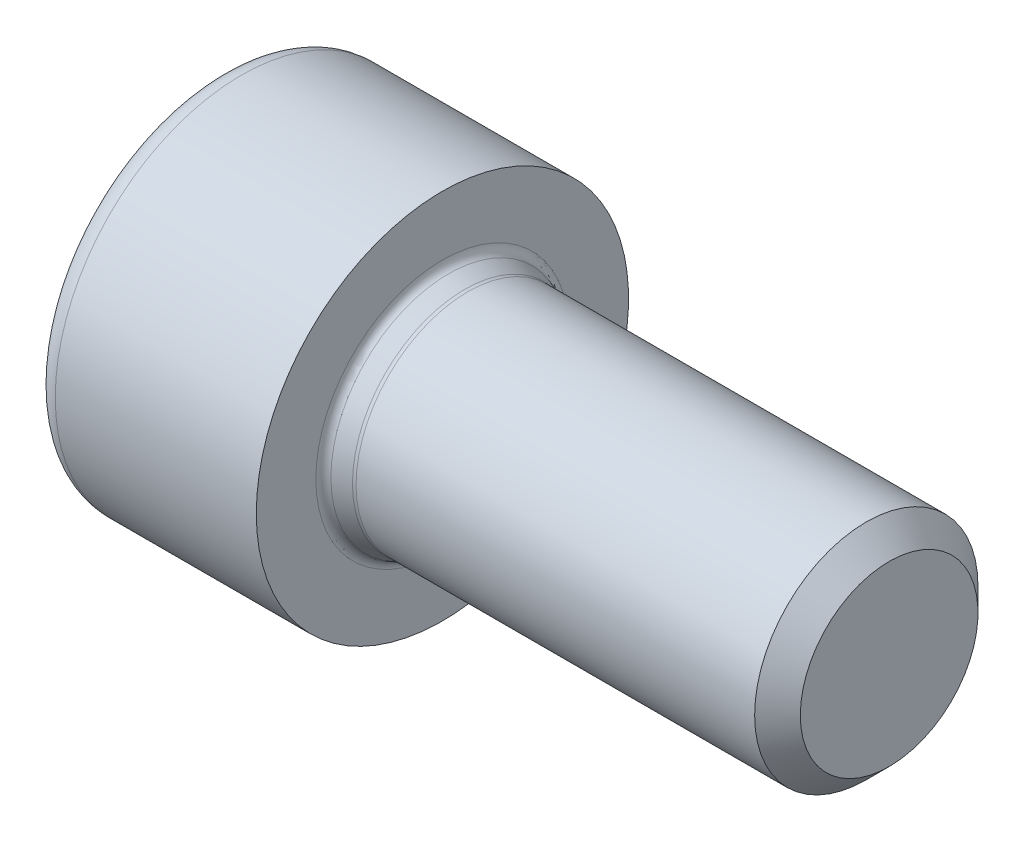
ISO-10303-21;
HEADER;
FILE_DESCRIPTION(('STEP AP214'),'2;1');
FILE_NAME('part.step','',(''),(''),'','','');
FILE_SCHEMA(('AUTOMOTIVE_DESIGN { 1 0 10303 214 1 1 1 1 }'));
ENDSEC;
DATA;
#1=APPLICATION_CONTEXT('core data for automotive mechanical design processes');
#2=APPLICATION_PROTOCOL_DEFINITION('international standard','automotive_design',2000,#1);
#3=PRODUCT_CONTEXT('',#1,'mechanical');
#4=PRODUCT('Part','Part','',(#3));
#5=PRODUCT_RELATED_PRODUCT_CATEGORY('part','',(#4));
#6=PRODUCT_DEFINITION_FORMATION('','',#4);
#7=PRODUCT_DEFINITION_CONTEXT('part definition',#1,'design');
#8=PRODUCT_DEFINITION('design','',#6,#7);
#9=PRODUCT_DEFINITION_SHAPE('','',#8);
#10=(LENGTH_UNIT() NAMED_UNIT(*) SI_UNIT(.MILLI.,.METRE.));
#11=(NAMED_UNIT(*) PLANE_ANGLE_UNIT() SI_UNIT($,.RADIAN.));
#12=(NAMED_UNIT(*) SI_UNIT($,.STERADIAN.) SOLID_ANGLE_UNIT());
#13=UNCERTAINTY_MEASURE_WITH_UNIT(LENGTH_MEASURE(1.E-05),#10,'distance_accuracy_value','');
#14=(GEOMETRIC_REPRESENTATION_CONTEXT(3) GLOBAL_UNCERTAINTY_ASSIGNED_CONTEXT((#13)) GLOBAL_UNIT_ASSIGNED_CONTEXT((#10,
#11,#12)) REPRESENTATION_CONTEXT('',''));
#15=CARTESIAN_POINT('',(0.,0.,0.));
#16=DIRECTION('',(0.,0.,1.));
#17=DIRECTION('',(1.,0.,0.));
#18=AXIS2_PLACEMENT_3D('',#15,#16,#17);
#19=CARTESIAN_POINT('',(-6.,2.5,0.));
#20=DIRECTION('',(1.,0.,0.));
#21=DIRECTION('',(0.,0.,-1.));
#22=AXIS2_PLACEMENT_3D('',#19,#20,#21);
#23=PLANE('',#22);
#24=DIRECTION('',(0.,0.5,-0.866025403784439));
#25=VECTOR('',#24,1.);
#26=CARTESIAN_POINT('',(-6.,-1.5400635094611,-2.33253175473055));
#27=LINE('',#26,#25);
#28=CARTESIAN_POINT('',(-6.,-2.88675134594813,0.));
#29=VERTEX_POINT('',#28);
#30=CARTESIAN_POINT('',(-6.,-1.44337567297406,-2.5));
#31=VERTEX_POINT('',#30);
#32=EDGE_CURVE('E250',#29,#31,#27,.T.);
#33=ORIENTED_EDGE('',*,*,#32,.T.);
#34=DIRECTION('',(0.,1.,0.));
#35=VECTOR('',#34,1.);
#36=CARTESIAN_POINT('',(-6.,2.5,-2.5));
#37=LINE('',#36,#35);
#38=CARTESIAN_POINT('',(-6.,1.44337567297406,-2.5));
#39=VERTEX_POINT('',#38);
#40=EDGE_CURVE('E52',#31,#39,#37,.T.);
#41=ORIENTED_EDGE('',*,*,#40,.T.);
#42=DIRECTION('',(0.,0.5,0.866025403784439));
#43=VECTOR('',#42,1.);
#44=CARTESIAN_POINT('',(-6.,2.7900635094611,-0.167468245269452));
#45=LINE('',#44,#43);
#46=CARTESIAN_POINT('',(-6.,2.88675134594813,0.));
#47=VERTEX_POINT('',#46);
#48=EDGE_CURVE('E100',#39,#47,#45,.T.);
#49=ORIENTED_EDGE('',*,*,#48,.T.);
#50=DIRECTION('',(0.,-0.5,0.866025403784439));
#51=VECTOR('',#50,1.);
#52=CARTESIAN_POINT('',(-6.,2.7900635094611,0.167468245269452));
#53=LINE('',#52,#51);
#54=CARTESIAN_POINT('',(-6.,1.44337567297406,2.5));
#55=VERTEX_POINT('',#54);
#56=EDGE_CURVE('E249',#47,#55,#53,.T.);
#57=ORIENTED_EDGE('',*,*,#56,.T.);
#58=DIRECTION('',(0.,-1.,0.));
#59=VECTOR('',#58,1.);
#60=CARTESIAN_POINT('',(-6.,2.5,2.5));
#61=LINE('',#60,#59);
#62=CARTESIAN_POINT('',(-6.,-1.44337567297406,2.5));
#63=VERTEX_POINT('',#62);
#64=EDGE_CURVE('E182',#55,#63,#61,.T.);
#65=ORIENTED_EDGE('',*,*,#64,.T.);
#66=DIRECTION('',(0.,-0.5,-0.866025403784439));
#67=VECTOR('',#66,1.);
#68=CARTESIAN_POINT('',(-6.,-1.5400635094611,2.33253175473055));
#69=LINE('',#68,#67);
#70=EDGE_CURVE('E241',#63,#29,#69,.T.);
#71=ORIENTED_EDGE('',*,*,#70,.T.);
#72=EDGE_LOOP('',(#33,#41,#49,#57,#65,#71));
#73=FACE_BOUND('',#72,.T.);
#74=CARTESIAN_POINT('',(-6.,0.,0.));
#75=DIRECTION('',(-1.,0.,0.));
#76=DIRECTION('',(0.,0.,1.));
#77=AXIS2_PLACEMENT_3D('',#74,#75,#76);
#78=CIRCLE('',#77,4.40000000000001);
#79=CARTESIAN_POINT('',(-6.,0.,4.40000000000001));
#80=VERTEX_POINT('',#79);
#81=EDGE_CURVE('E240',#80,#80,#78,.T.);
#82=ORIENTED_EDGE('',*,*,#81,.T.);
#83=EDGE_LOOP('',(#82));
#84=FACE_BOUND('',#83,.T.);
#85=ADVANCED_FACE('F90',(#73,#84),#23,.F.);
#86=CARTESIAN_POINT('',(-5.40000000000001,0.,0.));
#87=DIRECTION('',(-1.,0.,0.));
#88=DIRECTION('',(0.,0.,1.));
#89=AXIS2_PLACEMENT_3D('',#86,#87,#88);
#90=TOROIDAL_SURFACE('',#89,4.40000000000001,0.599999999999989);
#91=ORIENTED_EDGE('',*,*,#81,.F.);
#92=EDGE_LOOP('',(#91));
#93=FACE_BOUND('',#92,.T.);
#94=CARTESIAN_POINT('',(-5.4,0.,0.));
#95=DIRECTION('',(-1.,0.,0.));
#96=DIRECTION('',(0.,0.,1.));
#97=AXIS2_PLACEMENT_3D('',#94,#95,#96);
#98=CIRCLE('',#97,5.);
#99=CARTESIAN_POINT('',(-5.4,0.,5.));
#100=VERTEX_POINT('',#99);
#101=EDGE_CURVE('E233',#100,#100,#98,.T.);
#102=ORIENTED_EDGE('',*,*,#101,.T.);
#103=EDGE_LOOP('',(#102));
#104=FACE_BOUND('',#103,.T.);
#105=ADVANCED_FACE('F302',(#93,#104),#90,.T.);
#106=CARTESIAN_POINT('',(12.,0.,0.));
#107=DIRECTION('',(-1.,0.,0.));
#108=DIRECTION('',(0.,0.,1.));
#109=AXIS2_PLACEMENT_3D('',#106,#107,#108);
#110=CYLINDRICAL_SURFACE('',#109,5.);
#111=ORIENTED_EDGE('',*,*,#101,.F.);
#112=EDGE_LOOP('',(#111));
#113=FACE_BOUND('',#112,.T.);
#114=CARTESIAN_POINT('',(0.,0.,0.));
#115=DIRECTION('',(-1.,0.,0.));
#116=DIRECTION('',(0.,0.,1.));
#117=AXIS2_PLACEMENT_3D('',#114,#115,#116);
#118=CIRCLE('',#117,5.);
#119=CARTESIAN_POINT('',(0.,0.,5.));
#120=VERTEX_POINT('',#119);
#121=EDGE_CURVE('E234',#120,#120,#118,.T.);
#122=ORIENTED_EDGE('',*,*,#121,.T.);
#123=EDGE_LOOP('',(#122));
#124=FACE_BOUND('',#123,.T.);
#125=ADVANCED_FACE('F313',(#113,#124),#110,.T.);
#126=CARTESIAN_POINT('',(0.,5.,0.));
#127=DIRECTION('',(-1.,0.,0.));
#128=DIRECTION('',(0.,0.,1.));
#129=AXIS2_PLACEMENT_3D('',#126,#127,#128);
#130=PLANE('',#129);
#131=ORIENTED_EDGE('',*,*,#121,.F.);
#132=EDGE_LOOP('',(#131));
#133=FACE_BOUND('',#132,.T.);
#134=CARTESIAN_POINT('',(0.,0.,0.));
#135=DIRECTION('',(-1.,0.,0.));
#136=DIRECTION('',(0.,0.,1.));
#137=AXIS2_PLACEMENT_3D('',#134,#135,#136);
#138=CIRCLE('',#137,3.4);
#139=CARTESIAN_POINT('',(0.,0.,3.4));
#140=VERTEX_POINT('',#139);
#141=EDGE_CURVE('E229',#140,#140,#138,.T.);
#142=ORIENTED_EDGE('',*,*,#141,.T.);
#143=EDGE_LOOP('',(#142));
#144=FACE_BOUND('',#143,.T.);
#145=ADVANCED_FACE('F320',(#133,#144),#130,.F.);
#146=CARTESIAN_POINT('',(0.25,0.,0.));
#147=DIRECTION('',(-1.,0.,0.));
#148=DIRECTION('',(0.,0.,1.));
#149=AXIS2_PLACEMENT_3D('',#146,#147,#148);
#150=TOROIDAL_SURFACE('',#149,3.4,0.25);
#151=ORIENTED_EDGE('',*,*,#141,.F.);
#152=EDGE_LOOP('',(#151));
#153=FACE_BOUND('',#152,.T.);
#154=CARTESIAN_POINT('',(0.167656960920427,0.,0.));
#155=DIRECTION('',(-1.,0.,0.));
#156=DIRECTION('',(0.,0.,1.));
#157=AXIS2_PLACEMENT_3D('',#154,#155,#156);
#158=CIRCLE('',#157,3.16394995463856);
#159=CARTESIAN_POINT('',(0.167656960920427,0.,3.16394995463856));
#160=VERTEX_POINT('',#159);
#161=EDGE_CURVE('E223',#160,#160,#158,.T.);
#162=ORIENTED_EDGE('',*,*,#161,.T.);
#163=EDGE_LOOP('',(#162));
#164=FACE_BOUND('',#163,.T.);
#165=ADVANCED_FACE('F319',(#153,#164),#150,.F.);
#166=CARTESIAN_POINT('',(0.597656960920427,0.,0.));
#167=DIRECTION('',(-1.,0.,0.));
#168=DIRECTION('',(0.,0.,1.));
#169=AXIS2_PLACEMENT_3D('',#166,#167,#168);
#170=CONICAL_SURFACE('',#169,3.01394995463856,0.335638550327609);
#171=ORIENTED_EDGE('',*,*,#161,.F.);
#172=EDGE_LOOP('',(#171));
#173=FACE_BOUND('',#172,.T.);
#174=CARTESIAN_POINT('',(0.597656960920427,0.,0.));
#175=DIRECTION('',(-1.,0.,0.));
#176=DIRECTION('',(0.,0.,1.));
#177=AXIS2_PLACEMENT_3D('',#174,#175,#176);
#178=CIRCLE('',#177,3.01394995463856);
#179=CARTESIAN_POINT('',(0.597656960920427,0.,3.01394995463856));
#180=VERTEX_POINT('',#179);
#181=EDGE_CURVE('E225',#180,#180,#178,.T.);
#182=ORIENTED_EDGE('',*,*,#181,.T.);
#183=EDGE_LOOP('',(#182));
#184=FACE_BOUND('',#183,.T.);
#185=ADVANCED_FACE('F322',(#173,#184),#170,.T.);
#186=CARTESIAN_POINT('',(0.680000000000007,0.,0.));
#187=DIRECTION('',(-1.,0.,0.));
#188=DIRECTION('',(0.,0.,1.));
#189=AXIS2_PLACEMENT_3D('',#186,#187,#188);
#190=TOROIDAL_SURFACE('',#189,3.25000000000004,0.250000000000041);
#191=ORIENTED_EDGE('',*,*,#181,.F.);
#192=EDGE_LOOP('',(#191));
#193=FACE_BOUND('',#192,.T.);
#194=CARTESIAN_POINT('',(0.68,0.,0.));
#195=DIRECTION('',(-1.,0.,0.));
#196=DIRECTION('',(0.,0.,1.));
#197=AXIS2_PLACEMENT_3D('',#194,#195,#196);
#198=CIRCLE('',#197,3.);
#199=CARTESIAN_POINT('',(0.68,0.,3.));
#200=VERTEX_POINT('',#199);
#201=EDGE_CURVE('E218',#200,#200,#198,.T.);
#202=ORIENTED_EDGE('',*,*,#201,.T.);
#203=EDGE_LOOP('',(#202));
#204=FACE_BOUND('',#203,.T.);
#205=ADVANCED_FACE('F327',(#193,#204),#190,.F.);
#206=CARTESIAN_POINT('',(12.,0.,0.));
#207=DIRECTION('',(-1.,0.,0.));
#208=DIRECTION('',(0.,0.,1.));
#209=AXIS2_PLACEMENT_3D('',#206,#207,#208);
#210=CYLINDRICAL_SURFACE('',#209,3.);
#211=ORIENTED_EDGE('',*,*,#201,.F.);
#212=EDGE_LOOP('',(#211));
#213=FACE_BOUND('',#212,.T.);
#214=CARTESIAN_POINT('',(11.3865,0.,0.));
#215=DIRECTION('',(-1.,0.,0.));
#216=DIRECTION('',(0.,0.,1.));
#217=AXIS2_PLACEMENT_3D('',#214,#215,#216);
#218=CIRCLE('',#217,3.);
#219=CARTESIAN_POINT('',(11.3865,0.,3.));
#220=VERTEX_POINT('',#219);
#221=EDGE_CURVE('E216',#220,#220,#218,.T.);
#222=ORIENTED_EDGE('',*,*,#221,.T.);
#223=EDGE_LOOP('',(#222));
#224=FACE_BOUND('',#223,.T.);
#225=ADVANCED_FACE('F332',(#213,#224),#210,.T.);
#226=CARTESIAN_POINT('',(12.,0.,0.));
#227=DIRECTION('',(-1.,0.,0.));
#228=DIRECTION('',(0.,0.,1.));
#229=AXIS2_PLACEMENT_3D('',#226,#227,#228);
#230=CONICAL_SURFACE('',#229,2.3865,0.785398163397449);
#231=ORIENTED_EDGE('',*,*,#221,.F.);
#232=EDGE_LOOP('',(#231));
#233=FACE_BOUND('',#232,.T.);
#234=CARTESIAN_POINT('',(12.,0.,0.));
#235=DIRECTION('',(-1.,0.,0.));
#236=DIRECTION('',(0.,0.,1.));
#237=AXIS2_PLACEMENT_3D('',#234,#235,#236);
#238=CIRCLE('',#237,2.3865);
#239=CARTESIAN_POINT('',(12.,0.,2.3865));
#240=VERTEX_POINT('',#239);
#241=EDGE_CURVE('E206',#240,#240,#238,.T.);
#242=ORIENTED_EDGE('',*,*,#241,.T.);
#243=EDGE_LOOP('',(#242));
#244=FACE_BOUND('',#243,.T.);
#245=ADVANCED_FACE('F299',(#233,#244),#230,.T.);
#246=CARTESIAN_POINT('',(12.,2.3865,0.));
#247=DIRECTION('',(-1.,0.,0.));
#248=DIRECTION('',(0.,0.,1.));
#249=AXIS2_PLACEMENT_3D('',#246,#247,#248);
#250=PLANE('',#249);
#251=ORIENTED_EDGE('',*,*,#241,.F.);
#252=EDGE_LOOP('',(#251));
#253=FACE_BOUND('',#252,.T.);
#254=ADVANCED_FACE('F295',(#253),#250,.F.);
#255=CARTESIAN_POINT('',(-2.3,0.,0.));
#256=DIRECTION('',(1.,0.,0.));
#257=DIRECTION('',(0.,0.,-1.));
#258=AXIS2_PLACEMENT_3D('',#255,#256,#257);
#259=PLANE('',#258);
#260=DIRECTION('',(0.,1.,0.));
#261=VECTOR('',#260,1.);
#262=CARTESIAN_POINT('',(-2.3,-1.44337567297406,-2.5));
#263=LINE('',#262,#261);
#264=CARTESIAN_POINT('',(-2.3,-1.44337567297406,-2.5));
#265=VERTEX_POINT('',#264);
#266=CARTESIAN_POINT('',(-2.3,0.,-2.5));
#267=VERTEX_POINT('',#266);
#268=EDGE_CURVE('E102',#265,#267,#263,.T.);
#269=ORIENTED_EDGE('',*,*,#268,.F.);
#270=DIRECTION('',(0.,0.5,-0.866025403784439));
#271=VECTOR('',#270,1.);
#272=CARTESIAN_POINT('',(-2.3,-2.88675134594813,0.));
#273=LINE('',#272,#271);
#274=CARTESIAN_POINT('',(-2.3,-2.1650635094611,-1.25));
#275=VERTEX_POINT('',#274);
#276=EDGE_CURVE('E192',#275,#265,#273,.T.);
#277=ORIENTED_EDGE('',*,*,#276,.F.);
#278=CARTESIAN_POINT('',(-2.3,0.,0.));
#279=DIRECTION('',(-1.,0.,0.));
#280=DIRECTION('',(0.,0.,1.));
#281=AXIS2_PLACEMENT_3D('',#278,#279,#280);
#282=CIRCLE('',#281,2.5);
#283=EDGE_CURVE('E269',#267,#275,#282,.T.);
#284=ORIENTED_EDGE('',*,*,#283,.F.);
#285=EDGE_LOOP('',(#269,#277,#284));
#286=FACE_BOUND('',#285,.T.);
#287=ADVANCED_FACE('F287',(#286),#259,.F.);
#288=CARTESIAN_POINT('',(-2.3,-2.88675134594813,0.));
#289=VERTEX_POINT('',#288);
#290=EDGE_CURVE('E198',#289,#275,#273,.T.);
#291=ORIENTED_EDGE('',*,*,#290,.F.);
#292=DIRECTION('',(0.,-0.5,-0.866025403784439));
#293=VECTOR('',#292,1.);
#294=CARTESIAN_POINT('',(-2.3,-1.44337567297406,2.5));
#295=LINE('',#294,#293);
#296=CARTESIAN_POINT('',(-2.3,-2.1650635094611,1.25));
#297=VERTEX_POINT('',#296);
#298=EDGE_CURVE('E190',#297,#289,#295,.T.);
#299=ORIENTED_EDGE('',*,*,#298,.F.);
#300=EDGE_CURVE('E271',#275,#297,#282,.T.);
#301=ORIENTED_EDGE('',*,*,#300,.F.);
#302=EDGE_LOOP('',(#291,#299,#301));
#303=FACE_BOUND('',#302,.T.);
#304=ADVANCED_FACE('F276',(#303),#259,.F.);
#305=CARTESIAN_POINT('',(-2.3,-1.44337567297406,2.5));
#306=VERTEX_POINT('',#305);
#307=EDGE_CURVE('E194',#306,#297,#295,.T.);
#308=ORIENTED_EDGE('',*,*,#307,.F.);
#309=DIRECTION('',(0.,-1.,0.));
#310=VECTOR('',#309,1.);
#311=CARTESIAN_POINT('',(-2.3,1.44337567297406,2.5));
#312=LINE('',#311,#310);
#313=CARTESIAN_POINT('',(-2.3,0.,2.5));
#314=VERTEX_POINT('',#313);
#315=EDGE_CURVE('E189',#314,#306,#312,.T.);
#316=ORIENTED_EDGE('',*,*,#315,.F.);
#317=EDGE_CURVE('E238',#297,#314,#282,.T.);
#318=ORIENTED_EDGE('',*,*,#317,.F.);
#319=EDGE_LOOP('',(#308,#316,#318));
#320=FACE_BOUND('',#319,.T.);
#321=ADVANCED_FACE('F277',(#320),#259,.F.);
#322=CARTESIAN_POINT('',(-2.3,1.44337567297406,2.5));
#323=VERTEX_POINT('',#322);
#324=EDGE_CURVE('E180',#323,#314,#312,.T.);
#325=ORIENTED_EDGE('',*,*,#324,.F.);
#326=DIRECTION('',(0.,-0.5,0.866025403784439));
#327=VECTOR('',#326,1.);
#328=CARTESIAN_POINT('',(-2.3,2.88675134594813,0.));
#329=LINE('',#328,#327);
#330=CARTESIAN_POINT('',(-2.3,2.1650635094611,1.25));
#331=VERTEX_POINT('',#330);
#332=EDGE_CURVE('E164',#331,#323,#329,.T.);
#333=ORIENTED_EDGE('',*,*,#332,.F.);
#334=EDGE_CURVE('E183',#314,#331,#282,.T.);
#335=ORIENTED_EDGE('',*,*,#334,.F.);
#336=EDGE_LOOP('',(#325,#333,#335));
#337=FACE_BOUND('',#336,.T.);
#338=ADVANCED_FACE('F184',(#337),#259,.F.);
#339=CARTESIAN_POINT('',(-2.3,2.88675134594813,0.));
#340=VERTEX_POINT('',#339);
#341=EDGE_CURVE('E172',#340,#331,#329,.T.);
#342=ORIENTED_EDGE('',*,*,#341,.F.);
#343=DIRECTION('',(0.,0.5,0.866025403784439));
#344=VECTOR('',#343,1.);
#345=CARTESIAN_POINT('',(-2.3,1.44337567297406,-2.5));
#346=LINE('',#345,#344);
#347=CARTESIAN_POINT('',(-2.3,2.1650635094611,-1.25));
#348=VERTEX_POINT('',#347);
#349=EDGE_CURVE('E203',#348,#340,#346,.T.);
#350=ORIENTED_EDGE('',*,*,#349,.F.);
#351=EDGE_CURVE('E245',#331,#348,#282,.T.);
#352=ORIENTED_EDGE('',*,*,#351,.F.);
#353=EDGE_LOOP('',(#342,#350,#352));
#354=FACE_BOUND('',#353,.T.);
#355=ADVANCED_FACE('F305',(#354),#259,.F.);
#356=CARTESIAN_POINT('',(-2.3,1.44337567297406,-2.5));
#357=VERTEX_POINT('',#356);
#358=EDGE_CURVE('E185',#357,#348,#346,.T.);
#359=ORIENTED_EDGE('',*,*,#358,.F.);
#360=EDGE_CURVE('E200',#267,#357,#263,.T.);
#361=ORIENTED_EDGE('',*,*,#360,.F.);
#362=EDGE_CURVE('E262',#348,#267,#282,.T.);
#363=ORIENTED_EDGE('',*,*,#362,.F.);
#364=EDGE_LOOP('',(#359,#361,#363));
#365=FACE_BOUND('',#364,.T.);
#366=ADVANCED_FACE('F265',(#365),#259,.F.);
#367=CARTESIAN_POINT('',(-8.3,2.88675134594813,0.));
#368=DIRECTION('',(0.,0.866025403784439,0.5));
#369=DIRECTION('',(0.,-0.5,0.866025403784439));
#370=AXIS2_PLACEMENT_3D('',#367,#368,#369);
#371=PLANE('',#370);
#372=ORIENTED_EDGE('',*,*,#56,.F.);
#373=DIRECTION('',(1.,0.,0.));
#374=VECTOR('',#373,1.);
#375=CARTESIAN_POINT('',(-8.3,2.88675134594813,0.));
#376=LINE('',#375,#374);
#377=EDGE_CURVE('E204',#47,#340,#376,.T.);
#378=ORIENTED_EDGE('',*,*,#377,.T.);
#379=ORIENTED_EDGE('',*,*,#341,.T.);
#380=ORIENTED_EDGE('',*,*,#332,.T.);
#381=DIRECTION('',(1.,0.,0.));
#382=VECTOR('',#381,1.);
#383=CARTESIAN_POINT('',(-8.3,1.44337567297406,2.5));
#384=LINE('',#383,#382);
#385=EDGE_CURVE('E169',#55,#323,#384,.T.);
#386=ORIENTED_EDGE('',*,*,#385,.F.);
#387=EDGE_LOOP('',(#372,#378,#379,#380,#386));
#388=FACE_BOUND('',#387,.T.);
#389=ADVANCED_FACE('F170',(#388),#371,.F.);
#390=CARTESIAN_POINT('',(-8.3,1.44337567297406,-2.5));
#391=DIRECTION('',(0.,0.866025403784439,-0.5));
#392=DIRECTION('',(0.,0.5,0.866025403784439));
#393=AXIS2_PLACEMENT_3D('',#390,#391,#392);
#394=PLANE('',#393);
#395=ORIENTED_EDGE('',*,*,#48,.F.);
#396=DIRECTION('',(1.,0.,0.));
#397=VECTOR('',#396,1.);
#398=CARTESIAN_POINT('',(-8.3,1.44337567297406,-2.5));
#399=LINE('',#398,#397);
#400=EDGE_CURVE('E210',#39,#357,#399,.T.);
#401=ORIENTED_EDGE('',*,*,#400,.T.);
#402=ORIENTED_EDGE('',*,*,#358,.T.);
#403=ORIENTED_EDGE('',*,*,#349,.T.);
#404=ORIENTED_EDGE('',*,*,#377,.F.);
#405=EDGE_LOOP('',(#395,#401,#402,#403,#404));
#406=FACE_BOUND('',#405,.T.);
#407=ADVANCED_FACE('F258',(#406),#394,.F.);
#408=CARTESIAN_POINT('',(-8.3,-1.44337567297406,-2.5));
#409=DIRECTION('',(0.,0.,-1.));
#410=DIRECTION('',(-1.,0.,0.));
#411=AXIS2_PLACEMENT_3D('',#408,#409,#410);
#412=PLANE('',#411);
#413=ORIENTED_EDGE('',*,*,#40,.F.);
#414=DIRECTION('',(1.,0.,0.));
#415=VECTOR('',#414,1.);
#416=CARTESIAN_POINT('',(-8.3,-1.44337567297406,-2.5));
#417=LINE('',#416,#415);
#418=EDGE_CURVE('E207',#31,#265,#417,.T.);
#419=ORIENTED_EDGE('',*,*,#418,.T.);
#420=ORIENTED_EDGE('',*,*,#268,.T.);
#421=ORIENTED_EDGE('',*,*,#360,.T.);
#422=ORIENTED_EDGE('',*,*,#400,.F.);
#423=EDGE_LOOP('',(#413,#419,#420,#421,#422));
#424=FACE_BOUND('',#423,.T.);
#425=ADVANCED_FACE('F256',(#424),#412,.F.);
#426=CARTESIAN_POINT('',(-8.3,-2.88675134594813,0.));
#427=DIRECTION('',(0.,-0.866025403784439,-0.5));
#428=DIRECTION('',(0.,0.5,-0.866025403784439));
#429=AXIS2_PLACEMENT_3D('',#426,#427,#428);
#430=PLANE('',#429);
#431=ORIENTED_EDGE('',*,*,#32,.F.);
#432=DIRECTION('',(1.,0.,0.));
#433=VECTOR('',#432,1.);
#434=CARTESIAN_POINT('',(-8.3,-2.88675134594813,0.));
#435=LINE('',#434,#433);
#436=EDGE_CURVE('E211',#29,#289,#435,.T.);
#437=ORIENTED_EDGE('',*,*,#436,.T.);
#438=ORIENTED_EDGE('',*,*,#290,.T.);
#439=ORIENTED_EDGE('',*,*,#276,.T.);
#440=ORIENTED_EDGE('',*,*,#418,.F.);
#441=EDGE_LOOP('',(#431,#437,#438,#439,#440));
#442=FACE_BOUND('',#441,.T.);
#443=ADVANCED_FACE('F286',(#442),#430,.F.);
#444=CARTESIAN_POINT('',(-8.3,-1.44337567297406,2.5));
#445=DIRECTION('',(0.,-0.866025403784439,0.5));
#446=DIRECTION('',(0.,-0.5,-0.866025403784439));
#447=AXIS2_PLACEMENT_3D('',#444,#445,#446);
#448=PLANE('',#447);
#449=ORIENTED_EDGE('',*,*,#70,.F.);
#450=DIRECTION('',(1.,0.,0.));
#451=VECTOR('',#450,1.);
#452=CARTESIAN_POINT('',(-8.3,-1.44337567297406,2.5));
#453=LINE('',#452,#451);
#454=EDGE_CURVE('E115',#63,#306,#453,.T.);
#455=ORIENTED_EDGE('',*,*,#454,.T.);
#456=ORIENTED_EDGE('',*,*,#307,.T.);
#457=ORIENTED_EDGE('',*,*,#298,.T.);
#458=ORIENTED_EDGE('',*,*,#436,.F.);
#459=EDGE_LOOP('',(#449,#455,#456,#457,#458));
#460=FACE_BOUND('',#459,.T.);
#461=ADVANCED_FACE('F284',(#460),#448,.F.);
#462=CARTESIAN_POINT('',(-8.3,1.44337567297406,2.5));
#463=DIRECTION('',(0.,0.,1.));
#464=DIRECTION('',(1.,0.,0.));
#465=AXIS2_PLACEMENT_3D('',#462,#463,#464);
#466=PLANE('',#465);
#467=ORIENTED_EDGE('',*,*,#64,.F.);
#468=ORIENTED_EDGE('',*,*,#385,.T.);
#469=ORIENTED_EDGE('',*,*,#324,.T.);
#470=ORIENTED_EDGE('',*,*,#315,.T.);
#471=ORIENTED_EDGE('',*,*,#454,.F.);
#472=EDGE_LOOP('',(#467,#468,#469,#470,#471));
#473=FACE_BOUND('',#472,.T.);
#474=ADVANCED_FACE('F176',(#473),#466,.F.);
#475=CARTESIAN_POINT('',(-2.3,0.,0.));
#476=DIRECTION('',(-1.,0.,0.));
#477=DIRECTION('',(0.,0.,1.));
#478=AXIS2_PLACEMENT_3D('',#475,#476,#477);
#479=CONICAL_SURFACE('',#478,2.5,1.0471975511966);
#480=CARTESIAN_POINT('',(-0.856624327025939,0.,0.));
#481=VERTEX_POINT('',#480);
#482=VERTEX_LOOP('',#481);
#483=FACE_BOUND('',#482,.T.);
#484=ORIENTED_EDGE('',*,*,#334,.T.);
#485=ORIENTED_EDGE('',*,*,#351,.T.);
#486=ORIENTED_EDGE('',*,*,#362,.T.);
#487=ORIENTED_EDGE('',*,*,#283,.T.);
#488=ORIENTED_EDGE('',*,*,#300,.T.);
#489=ORIENTED_EDGE('',*,*,#317,.T.);
#490=EDGE_LOOP('',(#484,#485,#486,#487,#488,#489));
#491=FACE_BOUND('',#490,.T.);
#492=ADVANCED_FACE('F93',(#483,#491),#479,.F.);
#493=CLOSED_SHELL('',(#85,#105,#125,#145,#165,#185,#205,#225,#245,#254,#287,#304,#321,#338,#355,
#366,#389,#407,#425,#443,#461,#474,#492));
#494=MANIFOLD_SOLID_BREP('B6',#493);
#495=ADVANCED_BREP_SHAPE_REPRESENTATION('',(#18,#494),#14);
#496=SHAPE_DEFINITION_REPRESENTATION(#9,#495);
ENDSEC;
END-ISO-10303-21;
